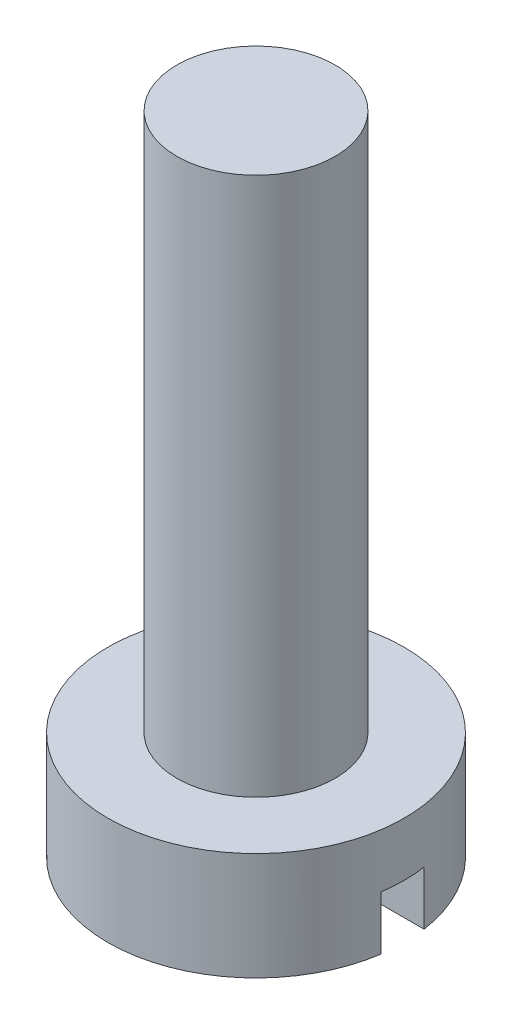
ISO-10303-21;
HEADER;
FILE_DESCRIPTION(('STEP AP214'),'2;1');
FILE_NAME('part.step','',(''),(''),'','','');
FILE_SCHEMA(('AUTOMOTIVE_DESIGN { 1 0 10303 214 1 1 1 1 }'));
ENDSEC;
DATA;
#1=APPLICATION_CONTEXT('core data for automotive mechanical design processes');
#2=APPLICATION_PROTOCOL_DEFINITION('international standard','automotive_design',2000,#1);
#3=PRODUCT_CONTEXT('',#1,'mechanical');
#4=PRODUCT('Part','Part','',(#3));
#5=PRODUCT_RELATED_PRODUCT_CATEGORY('part','',(#4));
#6=PRODUCT_DEFINITION_FORMATION('','',#4);
#7=PRODUCT_DEFINITION_CONTEXT('part definition',#1,'design');
#8=PRODUCT_DEFINITION('design','',#6,#7);
#9=PRODUCT_DEFINITION_SHAPE('','',#8);
#10=(LENGTH_UNIT() NAMED_UNIT(*) SI_UNIT(.MILLI.,.METRE.));
#11=(NAMED_UNIT(*) PLANE_ANGLE_UNIT() SI_UNIT($,.RADIAN.));
#12=(NAMED_UNIT(*) SI_UNIT($,.STERADIAN.) SOLID_ANGLE_UNIT());
#13=UNCERTAINTY_MEASURE_WITH_UNIT(LENGTH_MEASURE(1.E-05),#10,'distance_accuracy_value','');
#14=(GEOMETRIC_REPRESENTATION_CONTEXT(3) GLOBAL_UNCERTAINTY_ASSIGNED_CONTEXT((#13)) GLOBAL_UNIT_ASSIGNED_CONTEXT((#10,
#11,#12)) REPRESENTATION_CONTEXT('',''));
#15=CARTESIAN_POINT('',(0.,0.,0.));
#16=DIRECTION('',(0.,0.,1.));
#17=DIRECTION('',(1.,0.,0.));
#18=AXIS2_PLACEMENT_3D('',#15,#16,#17);
#19=CARTESIAN_POINT('',(0.,0.,0.));
#20=DIRECTION('',(0.,1.,0.));
#21=DIRECTION('',(0.,0.,1.));
#22=AXIS2_PLACEMENT_3D('',#19,#20,#21);
#23=PLANE('',#22);
#24=CARTESIAN_POINT('',(0.,0.,0.));
#25=DIRECTION('',(0.,1.,0.));
#26=DIRECTION('',(0.,0.,1.));
#27=AXIS2_PLACEMENT_3D('',#24,#25,#26);
#28=CIRCLE('',#27,2.75);
#29=CARTESIAN_POINT('',(2.72075357208256,0.,-0.4));
#30=VERTEX_POINT('',#29);
#31=CARTESIAN_POINT('',(-2.72075357208256,0.,-0.4));
#32=VERTEX_POINT('',#31);
#33=EDGE_CURVE('E133',#30,#32,#28,.T.);
#34=ORIENTED_EDGE('',*,*,#33,.F.);
#35=DIRECTION('',(1.,0.,0.));
#36=VECTOR('',#35,1.);
#37=CARTESIAN_POINT('',(0.,0.,-0.4));
#38=LINE('',#37,#36);
#39=EDGE_CURVE('E86',#32,#30,#38,.T.);
#40=ORIENTED_EDGE('',*,*,#39,.F.);
#41=EDGE_LOOP('',(#34,#40));
#42=FACE_BOUND('',#41,.T.);
#43=ADVANCED_FACE('F45',(#42),#23,.F.);
#44=CARTESIAN_POINT('',(0.,2.,0.));
#45=DIRECTION('',(0.,-1.,0.));
#46=DIRECTION('',(0.,0.,-1.));
#47=AXIS2_PLACEMENT_3D('',#44,#45,#46);
#48=CYLINDRICAL_SURFACE('',#47,2.75);
#49=CARTESIAN_POINT('',(0.,1.,0.));
#50=DIRECTION('',(0.,1.,0.));
#51=DIRECTION('',(0.,0.,1.));
#52=AXIS2_PLACEMENT_3D('',#49,#50,#51);
#53=CIRCLE('',#52,2.75);
#54=CARTESIAN_POINT('',(2.72075357208256,1.,0.4));
#55=VERTEX_POINT('',#54);
#56=CARTESIAN_POINT('',(2.72075357208256,1.,-0.4));
#57=VERTEX_POINT('',#56);
#58=EDGE_CURVE('E107',#55,#57,#53,.T.);
#59=ORIENTED_EDGE('',*,*,#58,.T.);
#60=DIRECTION('',(0.,-1.,0.));
#61=VECTOR('',#60,1.);
#62=CARTESIAN_POINT('',(2.72075357208256,1.,-0.4));
#63=LINE('',#62,#61);
#64=EDGE_CURVE('E72',#57,#30,#63,.T.);
#65=ORIENTED_EDGE('',*,*,#64,.T.);
#66=ORIENTED_EDGE('',*,*,#33,.T.);
#67=DIRECTION('',(0.,-1.,0.));
#68=VECTOR('',#67,1.);
#69=CARTESIAN_POINT('',(-2.72075357208256,1.,-0.4));
#70=LINE('',#69,#68);
#71=CARTESIAN_POINT('',(-2.72075357208256,1.,-0.4));
#72=VERTEX_POINT('',#71);
#73=EDGE_CURVE('E103',#72,#32,#70,.T.);
#74=ORIENTED_EDGE('',*,*,#73,.F.);
#75=CARTESIAN_POINT('',(0.,1.,0.));
#76=DIRECTION('',(0.,1.,0.));
#77=DIRECTION('',(0.,0.,1.));
#78=AXIS2_PLACEMENT_3D('',#75,#76,#77);
#79=CIRCLE('',#78,2.75);
#80=CARTESIAN_POINT('',(-2.72075357208256,1.,0.4));
#81=VERTEX_POINT('',#80);
#82=EDGE_CURVE('E92',#72,#81,#79,.T.);
#83=ORIENTED_EDGE('',*,*,#82,.T.);
#84=DIRECTION('',(0.,-1.,0.));
#85=VECTOR('',#84,1.);
#86=CARTESIAN_POINT('',(-2.72075357208256,1.,0.4));
#87=LINE('',#86,#85);
#88=CARTESIAN_POINT('',(-2.72075357208256,0.,0.4));
#89=VERTEX_POINT('',#88);
#90=EDGE_CURVE('E95',#81,#89,#87,.T.);
#91=ORIENTED_EDGE('',*,*,#90,.T.);
#92=CARTESIAN_POINT('',(2.72075357208256,0.,0.4));
#93=VERTEX_POINT('',#92);
#94=EDGE_CURVE('E49',#89,#93,#28,.T.);
#95=ORIENTED_EDGE('',*,*,#94,.T.);
#96=DIRECTION('',(0.,-1.,0.));
#97=VECTOR('',#96,1.);
#98=CARTESIAN_POINT('',(2.72075357208256,1.,0.4));
#99=LINE('',#98,#97);
#100=EDGE_CURVE('E63',#55,#93,#99,.T.);
#101=ORIENTED_EDGE('',*,*,#100,.F.);
#102=EDGE_LOOP('',(#59,#65,#66,#74,#83,#91,#95,#101));
#103=FACE_BOUND('',#102,.T.);
#104=CARTESIAN_POINT('',(0.,2.,0.));
#105=DIRECTION('',(0.,1.,0.));
#106=DIRECTION('',(0.,0.,1.));
#107=AXIS2_PLACEMENT_3D('',#104,#105,#106);
#108=CIRCLE('',#107,2.75);
#109=CARTESIAN_POINT('',(0.,2.,2.75));
#110=VERTEX_POINT('',#109);
#111=EDGE_CURVE('E55',#110,#110,#108,.T.);
#112=ORIENTED_EDGE('',*,*,#111,.F.);
#113=EDGE_LOOP('',(#112));
#114=FACE_BOUND('',#113,.T.);
#115=ADVANCED_FACE('F47',(#103,#114),#48,.T.);
#116=CARTESIAN_POINT('',(0.,2.,0.));
#117=DIRECTION('',(0.,1.,0.));
#118=DIRECTION('',(0.,0.,1.));
#119=AXIS2_PLACEMENT_3D('',#116,#117,#118);
#120=PLANE('',#119);
#121=CARTESIAN_POINT('',(0.,2.,0.));
#122=DIRECTION('',(0.,1.,0.));
#123=DIRECTION('',(0.,0.,1.));
#124=AXIS2_PLACEMENT_3D('',#121,#122,#123);
#125=CIRCLE('',#124,1.47);
#126=CARTESIAN_POINT('',(0.,2.,1.47));
#127=VERTEX_POINT('',#126);
#128=EDGE_CURVE('E11',#127,#127,#125,.T.);
#129=ORIENTED_EDGE('',*,*,#128,.F.);
#130=EDGE_LOOP('',(#129));
#131=FACE_BOUND('',#130,.T.);
#132=ORIENTED_EDGE('',*,*,#111,.T.);
#133=EDGE_LOOP('',(#132));
#134=FACE_BOUND('',#133,.T.);
#135=ADVANCED_FACE('F143',(#131,#134),#120,.T.);
#136=ORIENTED_EDGE('',*,*,#94,.F.);
#137=DIRECTION('',(-1.,0.,0.));
#138=VECTOR('',#137,1.);
#139=CARTESIAN_POINT('',(0.,0.,0.4));
#140=LINE('',#139,#138);
#141=EDGE_CURVE('E98',#93,#89,#140,.T.);
#142=ORIENTED_EDGE('',*,*,#141,.F.);
#143=EDGE_LOOP('',(#136,#142));
#144=FACE_BOUND('',#143,.T.);
#145=ADVANCED_FACE('F140',(#144),#23,.F.);
#146=CARTESIAN_POINT('',(0.,1.,-0.4));
#147=DIRECTION('',(0.,0.,-1.));
#148=DIRECTION('',(-1.,0.,0.));
#149=AXIS2_PLACEMENT_3D('',#146,#147,#148);
#150=PLANE('',#149);
#151=ORIENTED_EDGE('',*,*,#39,.T.);
#152=ORIENTED_EDGE('',*,*,#64,.F.);
#153=DIRECTION('',(1.,0.,0.));
#154=VECTOR('',#153,1.);
#155=CARTESIAN_POINT('',(0.,1.,-0.4));
#156=LINE('',#155,#154);
#157=EDGE_CURVE('E114',#72,#57,#156,.T.);
#158=ORIENTED_EDGE('',*,*,#157,.F.);
#159=ORIENTED_EDGE('',*,*,#73,.T.);
#160=EDGE_LOOP('',(#151,#152,#158,#159));
#161=FACE_BOUND('',#160,.T.);
#162=ADVANCED_FACE('F142',(#161),#150,.F.);
#163=CARTESIAN_POINT('',(0.,1.,0.4));
#164=DIRECTION('',(0.,0.,1.));
#165=DIRECTION('',(1.,0.,0.));
#166=AXIS2_PLACEMENT_3D('',#163,#164,#165);
#167=PLANE('',#166);
#168=ORIENTED_EDGE('',*,*,#141,.T.);
#169=ORIENTED_EDGE('',*,*,#90,.F.);
#170=DIRECTION('',(-1.,0.,0.));
#171=VECTOR('',#170,1.);
#172=CARTESIAN_POINT('',(0.,1.,0.4));
#173=LINE('',#172,#171);
#174=EDGE_CURVE('E97',#55,#81,#173,.T.);
#175=ORIENTED_EDGE('',*,*,#174,.F.);
#176=ORIENTED_EDGE('',*,*,#100,.T.);
#177=EDGE_LOOP('',(#168,#169,#175,#176));
#178=FACE_BOUND('',#177,.T.);
#179=ADVANCED_FACE('F96',(#178),#167,.F.);
#180=CARTESIAN_POINT('',(0.,1.,0.));
#181=DIRECTION('',(0.,1.,0.));
#182=DIRECTION('',(0.,0.,1.));
#183=AXIS2_PLACEMENT_3D('',#180,#181,#182);
#184=PLANE('',#183);
#185=ORIENTED_EDGE('',*,*,#157,.T.);
#186=ORIENTED_EDGE('',*,*,#58,.F.);
#187=ORIENTED_EDGE('',*,*,#174,.T.);
#188=ORIENTED_EDGE('',*,*,#82,.F.);
#189=EDGE_LOOP('',(#185,#186,#187,#188));
#190=FACE_BOUND('',#189,.T.);
#191=ADVANCED_FACE('F105',(#190),#184,.F.);
#192=CARTESIAN_POINT('',(0.,12.,0.));
#193=DIRECTION('',(0.,-1.,0.));
#194=DIRECTION('',(0.,0.,-1.));
#195=AXIS2_PLACEMENT_3D('',#192,#193,#194);
#196=CYLINDRICAL_SURFACE('',#195,1.47);
#197=CARTESIAN_POINT('',(0.,12.,0.));
#198=DIRECTION('',(0.,1.,0.));
#199=DIRECTION('',(0.,0.,1.));
#200=AXIS2_PLACEMENT_3D('',#197,#198,#199);
#201=CIRCLE('',#200,1.47);
#202=CARTESIAN_POINT('',(0.,12.,1.47));
#203=VERTEX_POINT('',#202);
#204=EDGE_CURVE('E123',#203,#203,#201,.T.);
#205=ORIENTED_EDGE('',*,*,#204,.F.);
#206=EDGE_LOOP('',(#205));
#207=FACE_BOUND('',#206,.T.);
#208=ORIENTED_EDGE('',*,*,#128,.T.);
#209=EDGE_LOOP('',(#208));
#210=FACE_BOUND('',#209,.T.);
#211=ADVANCED_FACE('F227',(#207,#210),#196,.T.);
#212=CARTESIAN_POINT('',(0.,12.,0.));
#213=DIRECTION('',(0.,1.,0.));
#214=DIRECTION('',(0.,0.,1.));
#215=AXIS2_PLACEMENT_3D('',#212,#213,#214);
#216=PLANE('',#215);
#217=ORIENTED_EDGE('',*,*,#204,.T.);
#218=EDGE_LOOP('',(#217));
#219=FACE_BOUND('',#218,.T.);
#220=ADVANCED_FACE('F241',(#219),#216,.T.);
#221=CLOSED_SHELL('',(#43,#115,#135,#145,#162,#179,#191,#211,#220));
#222=MANIFOLD_SOLID_BREP('B2',#221);
#223=ADVANCED_BREP_SHAPE_REPRESENTATION('',(#18,#222),#14);
#224=SHAPE_DEFINITION_REPRESENTATION(#9,#223);
ENDSEC;
END-ISO-10303-21;
